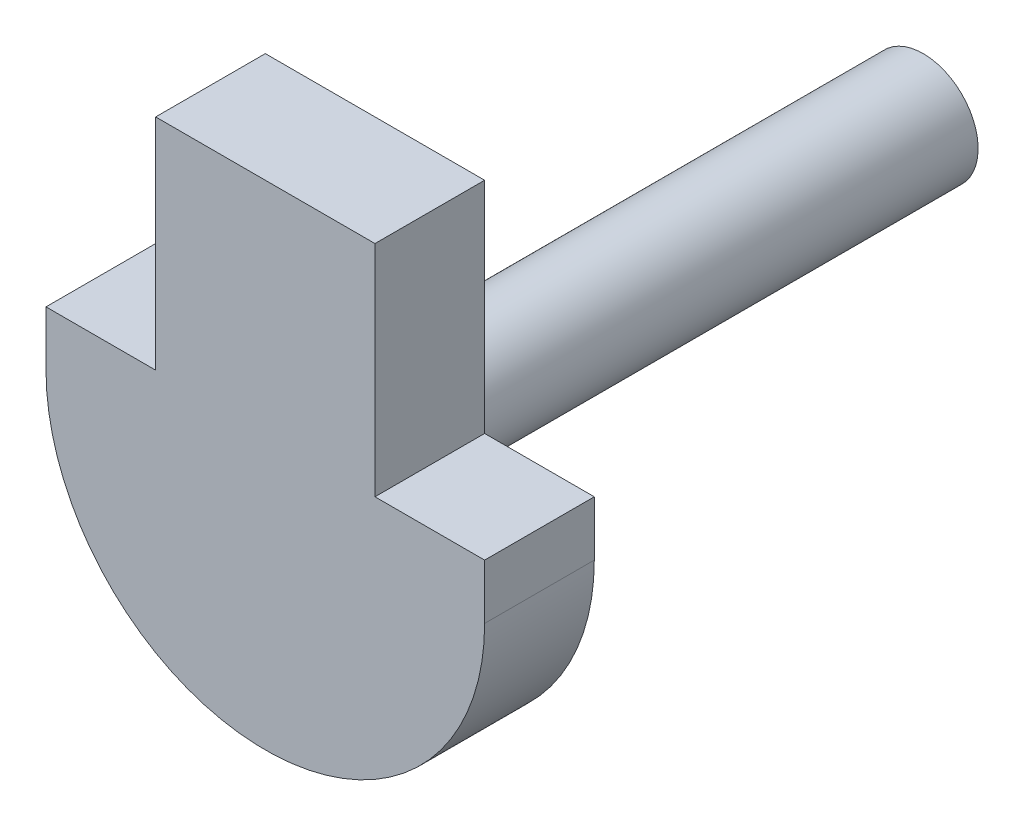
ISO-10303-21;
HEADER;
FILE_DESCRIPTION(('STEP AP214'),'2;1');
FILE_NAME('part.step','',(''),(''),'','','');
FILE_SCHEMA(('AUTOMOTIVE_DESIGN { 1 0 10303 214 1 1 1 1 }'));
ENDSEC;
DATA;
#1=APPLICATION_CONTEXT('core data for automotive mechanical design processes');
#2=APPLICATION_PROTOCOL_DEFINITION('international standard','automotive_design',2000,#1);
#3=PRODUCT_CONTEXT('',#1,'mechanical');
#4=PRODUCT('Part','Part','',(#3));
#5=PRODUCT_RELATED_PRODUCT_CATEGORY('part','',(#4));
#6=PRODUCT_DEFINITION_FORMATION('','',#4);
#7=PRODUCT_DEFINITION_CONTEXT('part definition',#1,'design');
#8=PRODUCT_DEFINITION('design','',#6,#7);
#9=PRODUCT_DEFINITION_SHAPE('','',#8);
#10=(LENGTH_UNIT() NAMED_UNIT(*) SI_UNIT(.MILLI.,.METRE.));
#11=(NAMED_UNIT(*) PLANE_ANGLE_UNIT() SI_UNIT($,.RADIAN.));
#12=(NAMED_UNIT(*) SI_UNIT($,.STERADIAN.) SOLID_ANGLE_UNIT());
#13=UNCERTAINTY_MEASURE_WITH_UNIT(LENGTH_MEASURE(1.E-05),#10,'distance_accuracy_value','');
#14=(GEOMETRIC_REPRESENTATION_CONTEXT(3) GLOBAL_UNCERTAINTY_ASSIGNED_CONTEXT((#13)) GLOBAL_UNIT_ASSIGNED_CONTEXT((#10,
#11,#12)) REPRESENTATION_CONTEXT('',''));
#15=CARTESIAN_POINT('',(0.,0.,0.));
#16=DIRECTION('',(0.,0.,1.));
#17=DIRECTION('',(1.,0.,0.));
#18=AXIS2_PLACEMENT_3D('',#15,#16,#17);
#19=CARTESIAN_POINT('',(0.,0.,10.));
#20=DIRECTION('',(0.,0.,-1.));
#21=DIRECTION('',(-1.,0.,0.));
#22=AXIS2_PLACEMENT_3D('',#19,#20,#21);
#23=CYLINDRICAL_SURFACE('',#22,20.);
#24=CARTESIAN_POINT('',(0.,0.,0.));
#25=DIRECTION('',(0.,0.,1.));
#26=DIRECTION('',(1.,0.,0.));
#27=AXIS2_PLACEMENT_3D('',#24,#25,#26);
#28=CIRCLE('',#27,20.);
#29=CARTESIAN_POINT('',(-20.,0.,0.));
#30=VERTEX_POINT('',#29);
#31=CARTESIAN_POINT('',(20.,0.,0.));
#32=VERTEX_POINT('',#31);
#33=EDGE_CURVE('E131',#30,#32,#28,.T.);
#34=ORIENTED_EDGE('',*,*,#33,.T.);
#35=DIRECTION('',(0.,0.,-1.));
#36=VECTOR('',#35,1.);
#37=CARTESIAN_POINT('',(20.,0.,10.));
#38=LINE('',#37,#36);
#39=CARTESIAN_POINT('',(20.,0.,10.));
#40=VERTEX_POINT('',#39);
#41=EDGE_CURVE('E36',#40,#32,#38,.T.);
#42=ORIENTED_EDGE('',*,*,#41,.F.);
#43=CARTESIAN_POINT('',(0.,0.,10.));
#44=DIRECTION('',(0.,0.,1.));
#45=DIRECTION('',(1.,0.,0.));
#46=AXIS2_PLACEMENT_3D('',#43,#44,#45);
#47=CIRCLE('',#46,20.);
#48=CARTESIAN_POINT('',(-20.,0.,10.));
#49=VERTEX_POINT('',#48);
#50=EDGE_CURVE('E146',#49,#40,#47,.T.);
#51=ORIENTED_EDGE('',*,*,#50,.F.);
#52=DIRECTION('',(0.,0.,-1.));
#53=VECTOR('',#52,1.);
#54=CARTESIAN_POINT('',(-20.,0.,10.));
#55=LINE('',#54,#53);
#56=EDGE_CURVE('E127',#49,#30,#55,.T.);
#57=ORIENTED_EDGE('',*,*,#56,.T.);
#58=EDGE_LOOP('',(#34,#42,#51,#57));
#59=FACE_BOUND('',#58,.T.);
#60=ADVANCED_FACE('F33',(#59),#23,.T.);
#61=CARTESIAN_POINT('',(20.,5.,10.));
#62=DIRECTION('',(-1.,0.,0.));
#63=DIRECTION('',(0.,0.,1.));
#64=AXIS2_PLACEMENT_3D('',#61,#62,#63);
#65=PLANE('',#64);
#66=DIRECTION('',(0.,1.,0.));
#67=VECTOR('',#66,1.);
#68=CARTESIAN_POINT('',(20.,5.,0.));
#69=LINE('',#68,#67);
#70=CARTESIAN_POINT('',(20.,5.,0.));
#71=VERTEX_POINT('',#70);
#72=EDGE_CURVE('E134',#32,#71,#69,.T.);
#73=ORIENTED_EDGE('',*,*,#72,.T.);
#74=DIRECTION('',(0.,0.,-1.));
#75=VECTOR('',#74,1.);
#76=CARTESIAN_POINT('',(20.,5.,10.));
#77=LINE('',#76,#75);
#78=CARTESIAN_POINT('',(20.,5.,10.));
#79=VERTEX_POINT('',#78);
#80=EDGE_CURVE('E155',#79,#71,#77,.T.);
#81=ORIENTED_EDGE('',*,*,#80,.F.);
#82=DIRECTION('',(0.,1.,0.));
#83=VECTOR('',#82,1.);
#84=CARTESIAN_POINT('',(20.,5.,10.));
#85=LINE('',#84,#83);
#86=EDGE_CURVE('E94',#40,#79,#85,.T.);
#87=ORIENTED_EDGE('',*,*,#86,.F.);
#88=ORIENTED_EDGE('',*,*,#41,.T.);
#89=EDGE_LOOP('',(#73,#81,#87,#88));
#90=FACE_BOUND('',#89,.T.);
#91=ADVANCED_FACE('F161',(#90),#65,.F.);
#92=CARTESIAN_POINT('',(10.,5.,10.));
#93=DIRECTION('',(0.,-1.,0.));
#94=DIRECTION('',(1.,0.,0.));
#95=AXIS2_PLACEMENT_3D('',#92,#93,#94);
#96=PLANE('',#95);
#97=DIRECTION('',(-1.,0.,0.));
#98=VECTOR('',#97,1.);
#99=CARTESIAN_POINT('',(10.,5.,0.));
#100=LINE('',#99,#98);
#101=CARTESIAN_POINT('',(10.,5.,0.));
#102=VERTEX_POINT('',#101);
#103=EDGE_CURVE('E137',#71,#102,#100,.T.);
#104=ORIENTED_EDGE('',*,*,#103,.T.);
#105=DIRECTION('',(0.,0.,-1.));
#106=VECTOR('',#105,1.);
#107=CARTESIAN_POINT('',(10.,5.,10.));
#108=LINE('',#107,#106);
#109=CARTESIAN_POINT('',(10.,5.,10.));
#110=VERTEX_POINT('',#109);
#111=EDGE_CURVE('E153',#110,#102,#108,.T.);
#112=ORIENTED_EDGE('',*,*,#111,.F.);
#113=DIRECTION('',(-1.,0.,0.));
#114=VECTOR('',#113,1.);
#115=CARTESIAN_POINT('',(10.,5.,10.));
#116=LINE('',#115,#114);
#117=EDGE_CURVE('E176',#79,#110,#116,.T.);
#118=ORIENTED_EDGE('',*,*,#117,.F.);
#119=ORIENTED_EDGE('',*,*,#80,.T.);
#120=EDGE_LOOP('',(#104,#112,#118,#119));
#121=FACE_BOUND('',#120,.T.);
#122=ADVANCED_FACE('F170',(#121),#96,.F.);
#123=CARTESIAN_POINT('',(10.,25.,10.));
#124=DIRECTION('',(-1.,0.,0.));
#125=DIRECTION('',(0.,-1.,0.));
#126=AXIS2_PLACEMENT_3D('',#123,#124,#125);
#127=PLANE('',#126);
#128=DIRECTION('',(0.,1.,0.));
#129=VECTOR('',#128,1.);
#130=CARTESIAN_POINT('',(10.,25.,0.));
#131=LINE('',#130,#129);
#132=CARTESIAN_POINT('',(10.,25.,0.));
#133=VERTEX_POINT('',#132);
#134=EDGE_CURVE('E139',#102,#133,#131,.T.);
#135=ORIENTED_EDGE('',*,*,#134,.T.);
#136=DIRECTION('',(0.,0.,-1.));
#137=VECTOR('',#136,1.);
#138=CARTESIAN_POINT('',(10.,25.,10.));
#139=LINE('',#138,#137);
#140=CARTESIAN_POINT('',(10.,25.,10.));
#141=VERTEX_POINT('',#140);
#142=EDGE_CURVE('E150',#141,#133,#139,.T.);
#143=ORIENTED_EDGE('',*,*,#142,.F.);
#144=DIRECTION('',(0.,1.,0.));
#145=VECTOR('',#144,1.);
#146=CARTESIAN_POINT('',(10.,25.,10.));
#147=LINE('',#146,#145);
#148=EDGE_CURVE('E175',#110,#141,#147,.T.);
#149=ORIENTED_EDGE('',*,*,#148,.F.);
#150=ORIENTED_EDGE('',*,*,#111,.T.);
#151=EDGE_LOOP('',(#135,#143,#149,#150));
#152=FACE_BOUND('',#151,.T.);
#153=ADVANCED_FACE('F173',(#152),#127,.F.);
#154=CARTESIAN_POINT('',(-10.,25.,10.));
#155=DIRECTION('',(0.,-1.,0.));
#156=DIRECTION('',(0.,0.,-1.));
#157=AXIS2_PLACEMENT_3D('',#154,#155,#156);
#158=PLANE('',#157);
#159=DIRECTION('',(-1.,0.,0.));
#160=VECTOR('',#159,1.);
#161=CARTESIAN_POINT('',(-10.,25.,0.));
#162=LINE('',#161,#160);
#163=CARTESIAN_POINT('',(-10.,25.,0.));
#164=VERTEX_POINT('',#163);
#165=EDGE_CURVE('E141',#133,#164,#162,.T.);
#166=ORIENTED_EDGE('',*,*,#165,.T.);
#167=DIRECTION('',(0.,0.,-1.));
#168=VECTOR('',#167,1.);
#169=CARTESIAN_POINT('',(-10.,25.,10.));
#170=LINE('',#169,#168);
#171=CARTESIAN_POINT('',(-10.,25.,10.));
#172=VERTEX_POINT('',#171);
#173=EDGE_CURVE('E122',#172,#164,#170,.T.);
#174=ORIENTED_EDGE('',*,*,#173,.F.);
#175=DIRECTION('',(-1.,0.,0.));
#176=VECTOR('',#175,1.);
#177=CARTESIAN_POINT('',(-10.,25.,10.));
#178=LINE('',#177,#176);
#179=EDGE_CURVE('E113',#141,#172,#178,.T.);
#180=ORIENTED_EDGE('',*,*,#179,.F.);
#181=ORIENTED_EDGE('',*,*,#142,.T.);
#182=EDGE_LOOP('',(#166,#174,#180,#181));
#183=FACE_BOUND('',#182,.T.);
#184=ADVANCED_FACE('F212',(#183),#158,.F.);
#185=CARTESIAN_POINT('',(-10.,5.,10.));
#186=DIRECTION('',(1.,0.,0.));
#187=DIRECTION('',(0.,0.,-1.));
#188=AXIS2_PLACEMENT_3D('',#185,#186,#187);
#189=PLANE('',#188);
#190=DIRECTION('',(0.,-1.,0.));
#191=VECTOR('',#190,1.);
#192=CARTESIAN_POINT('',(-10.,5.,0.));
#193=LINE('',#192,#191);
#194=CARTESIAN_POINT('',(-10.,5.,0.));
#195=VERTEX_POINT('',#194);
#196=EDGE_CURVE('E121',#164,#195,#193,.T.);
#197=ORIENTED_EDGE('',*,*,#196,.T.);
#198=DIRECTION('',(0.,0.,-1.));
#199=VECTOR('',#198,1.);
#200=CARTESIAN_POINT('',(-10.,5.,10.));
#201=LINE('',#200,#199);
#202=CARTESIAN_POINT('',(-10.,5.,10.));
#203=VERTEX_POINT('',#202);
#204=EDGE_CURVE('E118',#203,#195,#201,.T.);
#205=ORIENTED_EDGE('',*,*,#204,.F.);
#206=DIRECTION('',(0.,-1.,0.));
#207=VECTOR('',#206,1.);
#208=CARTESIAN_POINT('',(-10.,5.,10.));
#209=LINE('',#208,#207);
#210=EDGE_CURVE('E107',#172,#203,#209,.T.);
#211=ORIENTED_EDGE('',*,*,#210,.F.);
#212=ORIENTED_EDGE('',*,*,#173,.T.);
#213=EDGE_LOOP('',(#197,#205,#211,#212));
#214=FACE_BOUND('',#213,.T.);
#215=ADVANCED_FACE('F119',(#214),#189,.F.);
#216=CARTESIAN_POINT('',(-20.,5.,10.));
#217=DIRECTION('',(0.,-1.,0.));
#218=DIRECTION('',(0.,0.,-1.));
#219=AXIS2_PLACEMENT_3D('',#216,#217,#218);
#220=PLANE('',#219);
#221=DIRECTION('',(-1.,0.,0.));
#222=VECTOR('',#221,1.);
#223=CARTESIAN_POINT('',(-20.,5.,0.));
#224=LINE('',#223,#222);
#225=CARTESIAN_POINT('',(-20.,5.,0.));
#226=VERTEX_POINT('',#225);
#227=EDGE_CURVE('E79',#195,#226,#224,.T.);
#228=ORIENTED_EDGE('',*,*,#227,.T.);
#229=DIRECTION('',(0.,0.,-1.));
#230=VECTOR('',#229,1.);
#231=CARTESIAN_POINT('',(-20.,5.,10.));
#232=LINE('',#231,#230);
#233=CARTESIAN_POINT('',(-20.,5.,10.));
#234=VERTEX_POINT('',#233);
#235=EDGE_CURVE('E123',#234,#226,#232,.T.);
#236=ORIENTED_EDGE('',*,*,#235,.F.);
#237=DIRECTION('',(-1.,0.,0.));
#238=VECTOR('',#237,1.);
#239=CARTESIAN_POINT('',(-20.,5.,10.));
#240=LINE('',#239,#238);
#241=EDGE_CURVE('E111',#203,#234,#240,.T.);
#242=ORIENTED_EDGE('',*,*,#241,.F.);
#243=ORIENTED_EDGE('',*,*,#204,.T.);
#244=EDGE_LOOP('',(#228,#236,#242,#243));
#245=FACE_BOUND('',#244,.T.);
#246=ADVANCED_FACE('F125',(#245),#220,.F.);
#247=CARTESIAN_POINT('',(-20.,0.,10.));
#248=DIRECTION('',(1.,0.,0.));
#249=DIRECTION('',(0.,0.,-1.));
#250=AXIS2_PLACEMENT_3D('',#247,#248,#249);
#251=PLANE('',#250);
#252=DIRECTION('',(0.,-1.,0.));
#253=VECTOR('',#252,1.);
#254=CARTESIAN_POINT('',(-20.,0.,0.));
#255=LINE('',#254,#253);
#256=EDGE_CURVE('E85',#226,#30,#255,.T.);
#257=ORIENTED_EDGE('',*,*,#256,.T.);
#258=ORIENTED_EDGE('',*,*,#56,.F.);
#259=DIRECTION('',(0.,-1.,0.));
#260=VECTOR('',#259,1.);
#261=CARTESIAN_POINT('',(-20.,0.,10.));
#262=LINE('',#261,#260);
#263=EDGE_CURVE('E50',#234,#49,#262,.T.);
#264=ORIENTED_EDGE('',*,*,#263,.F.);
#265=ORIENTED_EDGE('',*,*,#235,.T.);
#266=EDGE_LOOP('',(#257,#258,#264,#265));
#267=FACE_BOUND('',#266,.T.);
#268=ADVANCED_FACE('F198',(#267),#251,.F.);
#269=CARTESIAN_POINT('',(0.,0.,10.));
#270=DIRECTION('',(0.,0.,1.));
#271=DIRECTION('',(1.,0.,0.));
#272=AXIS2_PLACEMENT_3D('',#269,#270,#271);
#273=PLANE('',#272);
#274=ORIENTED_EDGE('',*,*,#50,.T.);
#275=ORIENTED_EDGE('',*,*,#86,.T.);
#276=ORIENTED_EDGE('',*,*,#117,.T.);
#277=ORIENTED_EDGE('',*,*,#148,.T.);
#278=ORIENTED_EDGE('',*,*,#179,.T.);
#279=ORIENTED_EDGE('',*,*,#210,.T.);
#280=ORIENTED_EDGE('',*,*,#241,.T.);
#281=ORIENTED_EDGE('',*,*,#263,.T.);
#282=EDGE_LOOP('',(#274,#275,#276,#277,#278,#279,#280,#281));
#283=FACE_BOUND('',#282,.T.);
#284=ADVANCED_FACE('F109',(#283),#273,.T.);
#285=CARTESIAN_POINT('',(0.,0.,0.));
#286=DIRECTION('',(0.,0.,1.));
#287=DIRECTION('',(1.,0.,0.));
#288=AXIS2_PLACEMENT_3D('',#285,#286,#287);
#289=PLANE('',#288);
#290=CARTESIAN_POINT('',(0.,0.,0.));
#291=DIRECTION('',(0.,0.,-1.));
#292=DIRECTION('',(-1.,0.,0.));
#293=AXIS2_PLACEMENT_3D('',#290,#291,#292);
#294=CIRCLE('',#293,5.);
#295=CARTESIAN_POINT('',(-5.,0.,0.));
#296=VERTEX_POINT('',#295);
#297=EDGE_CURVE('E11',#296,#296,#294,.T.);
#298=ORIENTED_EDGE('',*,*,#297,.F.);
#299=EDGE_LOOP('',(#298));
#300=FACE_BOUND('',#299,.T.);
#301=ORIENTED_EDGE('',*,*,#33,.F.);
#302=ORIENTED_EDGE('',*,*,#256,.F.);
#303=ORIENTED_EDGE('',*,*,#227,.F.);
#304=ORIENTED_EDGE('',*,*,#196,.F.);
#305=ORIENTED_EDGE('',*,*,#165,.F.);
#306=ORIENTED_EDGE('',*,*,#134,.F.);
#307=ORIENTED_EDGE('',*,*,#103,.F.);
#308=ORIENTED_EDGE('',*,*,#72,.F.);
#309=EDGE_LOOP('',(#301,#302,#303,#304,#305,#306,#307,#308));
#310=FACE_BOUND('',#309,.T.);
#311=ADVANCED_FACE('F166',(#300,#310),#289,.F.);
#312=CARTESIAN_POINT('',(0.,0.,-50.));
#313=DIRECTION('',(0.,0.,1.));
#314=DIRECTION('',(1.,0.,0.));
#315=AXIS2_PLACEMENT_3D('',#312,#313,#314);
#316=CYLINDRICAL_SURFACE('',#315,5.);
#317=CARTESIAN_POINT('',(0.,0.,-50.));
#318=DIRECTION('',(0.,0.,-1.));
#319=DIRECTION('',(-1.,0.,0.));
#320=AXIS2_PLACEMENT_3D('',#317,#318,#319);
#321=CIRCLE('',#320,5.);
#322=CARTESIAN_POINT('',(-5.,0.,-50.));
#323=VERTEX_POINT('',#322);
#324=EDGE_CURVE('E135',#323,#323,#321,.T.);
#325=ORIENTED_EDGE('',*,*,#324,.F.);
#326=EDGE_LOOP('',(#325));
#327=FACE_BOUND('',#326,.T.);
#328=ORIENTED_EDGE('',*,*,#297,.T.);
#329=EDGE_LOOP('',(#328));
#330=FACE_BOUND('',#329,.T.);
#331=ADVANCED_FACE('F187',(#327,#330),#316,.T.);
#332=CARTESIAN_POINT('',(0.,0.,-50.));
#333=DIRECTION('',(0.,0.,-1.));
#334=DIRECTION('',(-1.,0.,0.));
#335=AXIS2_PLACEMENT_3D('',#332,#333,#334);
#336=PLANE('',#335);
#337=ORIENTED_EDGE('',*,*,#324,.T.);
#338=EDGE_LOOP('',(#337));
#339=FACE_BOUND('',#338,.T.);
#340=ADVANCED_FACE('F185',(#339),#336,.T.);
#341=CLOSED_SHELL('',(#60,#91,#122,#153,#184,#215,#246,#268,#284,#311,#331,#340));
#342=MANIFOLD_SOLID_BREP('B2',#341);
#343=ADVANCED_BREP_SHAPE_REPRESENTATION('',(#18,#342),#14);
#344=SHAPE_DEFINITION_REPRESENTATION(#9,#343);
ENDSEC;
END-ISO-10303-21;
